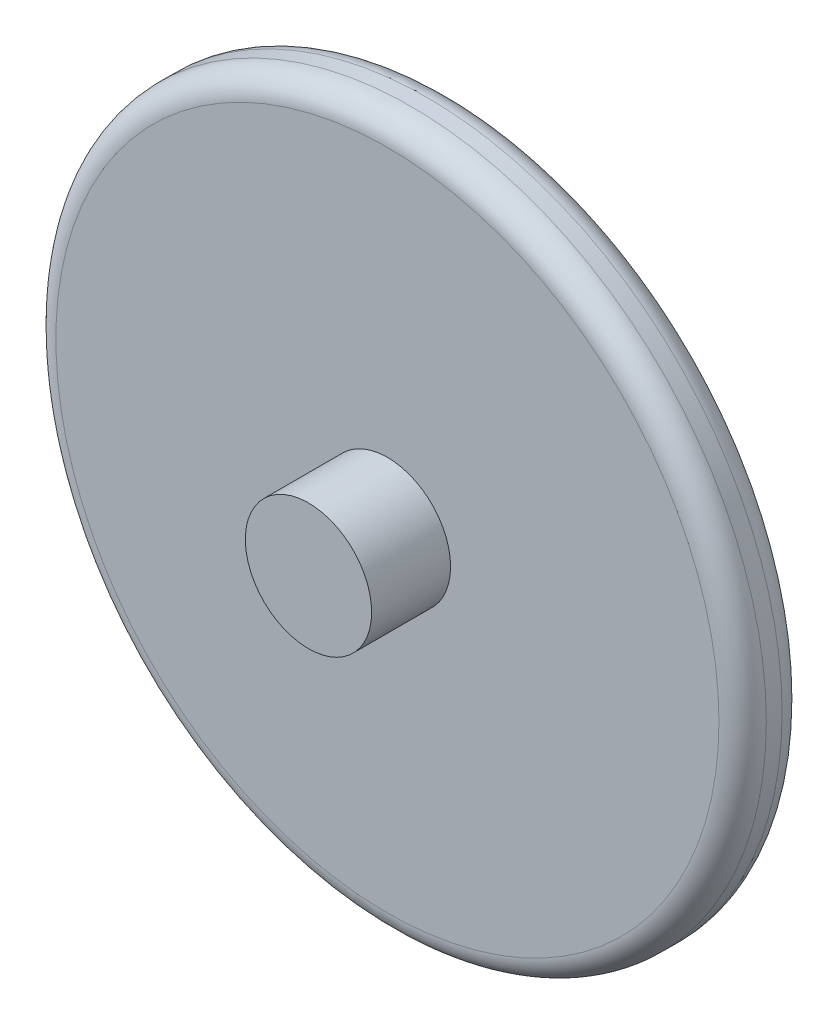
ISO-10303-21;
HEADER;
FILE_DESCRIPTION(('STEP AP214'),'2;1');
FILE_NAME('part.step','',(''),(''),'','','');
FILE_SCHEMA(('AUTOMOTIVE_DESIGN { 1 0 10303 214 1 1 1 1 }'));
ENDSEC;
DATA;
#1=APPLICATION_CONTEXT('core data for automotive mechanical design processes');
#2=APPLICATION_PROTOCOL_DEFINITION('international standard','automotive_design',2000,#1);
#3=PRODUCT_CONTEXT('',#1,'mechanical');
#4=PRODUCT('Part','Part','',(#3));
#5=PRODUCT_RELATED_PRODUCT_CATEGORY('part','',(#4));
#6=PRODUCT_DEFINITION_FORMATION('','',#4);
#7=PRODUCT_DEFINITION_CONTEXT('part definition',#1,'design');
#8=PRODUCT_DEFINITION('design','',#6,#7);
#9=PRODUCT_DEFINITION_SHAPE('','',#8);
#10=(LENGTH_UNIT() NAMED_UNIT(*) SI_UNIT(.MILLI.,.METRE.));
#11=(NAMED_UNIT(*) PLANE_ANGLE_UNIT() SI_UNIT($,.RADIAN.));
#12=(NAMED_UNIT(*) SI_UNIT($,.STERADIAN.) SOLID_ANGLE_UNIT());
#13=UNCERTAINTY_MEASURE_WITH_UNIT(LENGTH_MEASURE(1.E-05),#10,'distance_accuracy_value','');
#14=(GEOMETRIC_REPRESENTATION_CONTEXT(3) GLOBAL_UNCERTAINTY_ASSIGNED_CONTEXT((#13)) GLOBAL_UNIT_ASSIGNED_CONTEXT((#10,
#11,#12)) REPRESENTATION_CONTEXT('',''));
#15=CARTESIAN_POINT('',(0.,0.,0.));
#16=DIRECTION('',(0.,0.,1.));
#17=DIRECTION('',(1.,0.,0.));
#18=AXIS2_PLACEMENT_3D('',#15,#16,#17);
#19=CARTESIAN_POINT('',(0.,0.,8.));
#20=DIRECTION('',(0.,0.,-1.));
#21=DIRECTION('',(-1.,0.,0.));
#22=AXIS2_PLACEMENT_3D('',#19,#20,#21);
#23=CYLINDRICAL_SURFACE('',#22,45.);
#24=CARTESIAN_POINT('',(0.,0.,3.));
#25=DIRECTION('',(0.,0.,1.));
#26=DIRECTION('',(1.,0.,0.));
#27=AXIS2_PLACEMENT_3D('',#24,#25,#26);
#28=CIRCLE('',#27,45.);
#29=CARTESIAN_POINT('',(45.,0.,3.));
#30=VERTEX_POINT('',#29);
#31=EDGE_CURVE('E42',#30,#30,#28,.T.);
#32=ORIENTED_EDGE('',*,*,#31,.T.);
#33=EDGE_LOOP('',(#32));
#34=FACE_BOUND('',#33,.T.);
#35=CARTESIAN_POINT('',(0.,0.,5.));
#36=DIRECTION('',(0.,0.,1.));
#37=DIRECTION('',(1.,0.,0.));
#38=AXIS2_PLACEMENT_3D('',#35,#36,#37);
#39=CIRCLE('',#38,45.);
#40=CARTESIAN_POINT('',(45.,0.,5.));
#41=VERTEX_POINT('',#40);
#42=EDGE_CURVE('E46',#41,#41,#39,.F.);
#43=ORIENTED_EDGE('',*,*,#42,.T.);
#44=EDGE_LOOP('',(#43));
#45=FACE_BOUND('',#44,.T.);
#46=ADVANCED_FACE('F31',(#34,#45),#23,.T.);
#47=CARTESIAN_POINT('',(0.,0.,8.));
#48=DIRECTION('',(0.,0.,1.));
#49=DIRECTION('',(1.,0.,0.));
#50=AXIS2_PLACEMENT_3D('',#47,#48,#49);
#51=PLANE('',#50);
#52=CARTESIAN_POINT('',(0.,0.,8.));
#53=DIRECTION('',(0.,0.,1.));
#54=DIRECTION('',(1.,0.,0.));
#55=AXIS2_PLACEMENT_3D('',#52,#53,#54);
#56=CIRCLE('',#55,42.);
#57=CARTESIAN_POINT('',(42.,0.,8.));
#58=VERTEX_POINT('',#57);
#59=EDGE_CURVE('E10',#58,#58,#56,.T.);
#60=ORIENTED_EDGE('',*,*,#59,.T.);
#61=EDGE_LOOP('',(#60));
#62=FACE_BOUND('',#61,.T.);
#63=CARTESIAN_POINT('',(0.,0.,8.));
#64=DIRECTION('',(0.,0.,1.));
#65=DIRECTION('',(1.,0.,0.));
#66=AXIS2_PLACEMENT_3D('',#63,#64,#65);
#67=CIRCLE('',#66,8.);
#68=CARTESIAN_POINT('',(8.,0.,8.));
#69=VERTEX_POINT('',#68);
#70=EDGE_CURVE('E52',#69,#69,#67,.T.);
#71=ORIENTED_EDGE('',*,*,#70,.F.);
#72=EDGE_LOOP('',(#71));
#73=FACE_BOUND('',#72,.T.);
#74=ADVANCED_FACE('F67',(#62,#73),#51,.T.);
#75=CARTESIAN_POINT('',(0.,0.,0.));
#76=DIRECTION('',(0.,0.,1.));
#77=DIRECTION('',(1.,0.,0.));
#78=AXIS2_PLACEMENT_3D('',#75,#76,#77);
#79=PLANE('',#78);
#80=CARTESIAN_POINT('',(0.,0.,0.));
#81=DIRECTION('',(0.,0.,1.));
#82=DIRECTION('',(1.,0.,0.));
#83=AXIS2_PLACEMENT_3D('',#80,#81,#82);
#84=CIRCLE('',#83,42.);
#85=CARTESIAN_POINT('',(42.,0.,0.));
#86=VERTEX_POINT('',#85);
#87=EDGE_CURVE('E38',#86,#86,#84,.F.);
#88=ORIENTED_EDGE('',*,*,#87,.T.);
#89=EDGE_LOOP('',(#88));
#90=FACE_BOUND('',#89,.T.);
#91=ADVANCED_FACE('F63',(#90),#79,.F.);
#92=CARTESIAN_POINT('',(0.,0.,18.));
#93=DIRECTION('',(0.,0.,-1.));
#94=DIRECTION('',(-1.,0.,0.));
#95=AXIS2_PLACEMENT_3D('',#92,#93,#94);
#96=CYLINDRICAL_SURFACE('',#95,8.);
#97=CARTESIAN_POINT('',(0.,0.,18.));
#98=DIRECTION('',(0.,0.,1.));
#99=DIRECTION('',(1.,0.,0.));
#100=AXIS2_PLACEMENT_3D('',#97,#98,#99);
#101=CIRCLE('',#100,8.);
#102=CARTESIAN_POINT('',(8.,0.,18.));
#103=VERTEX_POINT('',#102);
#104=EDGE_CURVE('E51',#103,#103,#101,.T.);
#105=ORIENTED_EDGE('',*,*,#104,.F.);
#106=EDGE_LOOP('',(#105));
#107=FACE_BOUND('',#106,.T.);
#108=ORIENTED_EDGE('',*,*,#70,.T.);
#109=EDGE_LOOP('',(#108));
#110=FACE_BOUND('',#109,.T.);
#111=ADVANCED_FACE('F60',(#107,#110),#96,.T.);
#112=CARTESIAN_POINT('',(0.,0.,18.));
#113=DIRECTION('',(0.,0.,1.));
#114=DIRECTION('',(1.,0.,0.));
#115=AXIS2_PLACEMENT_3D('',#112,#113,#114);
#116=PLANE('',#115);
#117=ORIENTED_EDGE('',*,*,#104,.T.);
#118=EDGE_LOOP('',(#117));
#119=FACE_BOUND('',#118,.T.);
#120=ADVANCED_FACE('F58',(#119),#116,.T.);
#121=CARTESIAN_POINT('',(0.,0.,3.));
#122=DIRECTION('',(0.,0.,1.));
#123=DIRECTION('',(1.,0.,0.));
#124=AXIS2_PLACEMENT_3D('',#121,#122,#123);
#125=TOROIDAL_SURFACE('',#124,42.,3.);
#126=ORIENTED_EDGE('',*,*,#87,.F.);
#127=EDGE_LOOP('',(#126));
#128=FACE_BOUND('',#127,.T.);
#129=ORIENTED_EDGE('',*,*,#31,.F.);
#130=EDGE_LOOP('',(#129));
#131=FACE_BOUND('',#130,.T.);
#132=ADVANCED_FACE('F78',(#128,#131),#125,.T.);
#133=CARTESIAN_POINT('',(0.,0.,5.));
#134=DIRECTION('',(0.,0.,1.));
#135=DIRECTION('',(1.,0.,0.));
#136=AXIS2_PLACEMENT_3D('',#133,#134,#135);
#137=TOROIDAL_SURFACE('',#136,42.,3.);
#138=ORIENTED_EDGE('',*,*,#42,.F.);
#139=EDGE_LOOP('',(#138));
#140=FACE_BOUND('',#139,.T.);
#141=ORIENTED_EDGE('',*,*,#59,.F.);
#142=EDGE_LOOP('',(#141));
#143=FACE_BOUND('',#142,.T.);
#144=ADVANCED_FACE('F33',(#140,#143),#137,.T.);
#145=CLOSED_SHELL('',(#46,#74,#91,#111,#120,#132,#144));
#146=MANIFOLD_SOLID_BREP('B2',#145);
#147=ADVANCED_BREP_SHAPE_REPRESENTATION('',(#18,#146),#14);
#148=SHAPE_DEFINITION_REPRESENTATION(#9,#147);
ENDSEC;
END-ISO-10303-21;
